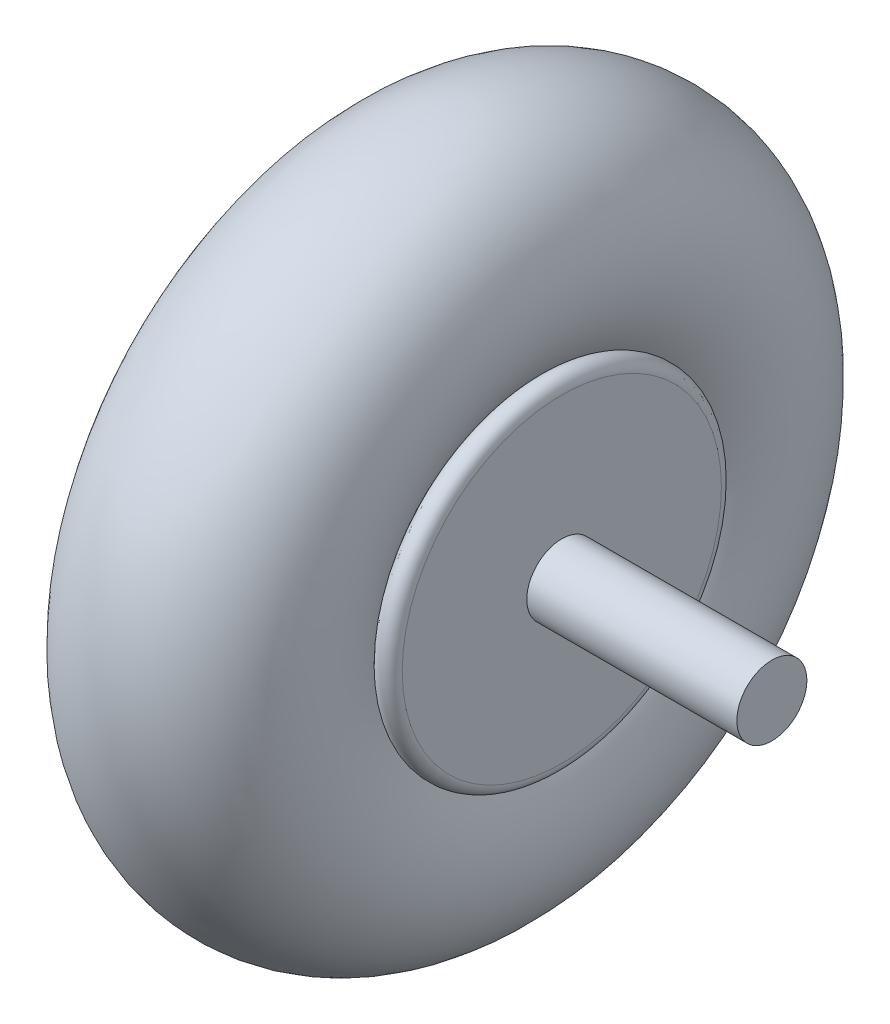
ISO-10303-21;
HEADER;
FILE_DESCRIPTION(('STEP AP214'),'2;1');
FILE_NAME('part.step','',(''),(''),'','','');
FILE_SCHEMA(('AUTOMOTIVE_DESIGN { 1 0 10303 214 1 1 1 1 }'));
ENDSEC;
DATA;
#1=APPLICATION_CONTEXT('core data for automotive mechanical design processes');
#2=APPLICATION_PROTOCOL_DEFINITION('international standard','automotive_design',2000,#1);
#3=PRODUCT_CONTEXT('',#1,'mechanical');
#4=PRODUCT('Part','Part','',(#3));
#5=PRODUCT_RELATED_PRODUCT_CATEGORY('part','',(#4));
#6=PRODUCT_DEFINITION_FORMATION('','',#4);
#7=PRODUCT_DEFINITION_CONTEXT('part definition',#1,'design');
#8=PRODUCT_DEFINITION('design','',#6,#7);
#9=PRODUCT_DEFINITION_SHAPE('','',#8);
#10=(LENGTH_UNIT() NAMED_UNIT(*) SI_UNIT(.MILLI.,.METRE.));
#11=(NAMED_UNIT(*) PLANE_ANGLE_UNIT() SI_UNIT($,.RADIAN.));
#12=(NAMED_UNIT(*) SI_UNIT($,.STERADIAN.) SOLID_ANGLE_UNIT());
#13=UNCERTAINTY_MEASURE_WITH_UNIT(LENGTH_MEASURE(1.E-05),#10,'distance_accuracy_value','');
#14=(GEOMETRIC_REPRESENTATION_CONTEXT(3) GLOBAL_UNCERTAINTY_ASSIGNED_CONTEXT((#13)) GLOBAL_UNIT_ASSIGNED_CONTEXT((#10,
#11,#12)) REPRESENTATION_CONTEXT('',''));
#15=CARTESIAN_POINT('',(0.,0.,0.));
#16=DIRECTION('',(0.,0.,1.));
#17=DIRECTION('',(1.,0.,0.));
#18=AXIS2_PLACEMENT_3D('',#15,#16,#17);
#19=CARTESIAN_POINT('',(-18.,0.,0.));
#20=DIRECTION('',(1.,0.,0.));
#21=DIRECTION('',(0.,0.,-1.));
#22=AXIS2_PLACEMENT_3D('',#19,#20,#21);
#23=CYLINDRICAL_SURFACE('',#22,3.);
#24=CARTESIAN_POINT('',(-18.,0.,0.));
#25=DIRECTION('',(-1.,0.,0.));
#26=DIRECTION('',(0.,0.,1.));
#27=AXIS2_PLACEMENT_3D('',#24,#25,#26);
#28=CIRCLE('',#27,3.);
#29=CARTESIAN_POINT('',(-18.,0.,3.));
#30=VERTEX_POINT('',#29);
#31=EDGE_CURVE('E11',#30,#30,#28,.T.);
#32=ORIENTED_EDGE('',*,*,#31,.F.);
#33=EDGE_LOOP('',(#32));
#34=FACE_BOUND('',#33,.T.);
#35=CARTESIAN_POINT('',(-10.,0.,0.));
#36=DIRECTION('',(1.,0.,0.));
#37=DIRECTION('',(0.,0.,-1.));
#38=AXIS2_PLACEMENT_3D('',#35,#36,#37);
#39=CIRCLE('',#38,3.);
#40=CARTESIAN_POINT('',(-10.,0.,-3.));
#41=VERTEX_POINT('',#40);
#42=EDGE_CURVE('E49',#41,#41,#39,.T.);
#43=ORIENTED_EDGE('',*,*,#42,.F.);
#44=EDGE_LOOP('',(#43));
#45=FACE_BOUND('',#44,.T.);
#46=ADVANCED_FACE('F43',(#34,#45),#23,.T.);
#47=CARTESIAN_POINT('',(-18.,0.,0.));
#48=DIRECTION('',(-1.,0.,0.));
#49=DIRECTION('',(0.,0.,1.));
#50=AXIS2_PLACEMENT_3D('',#47,#48,#49);
#51=PLANE('',#50);
#52=ORIENTED_EDGE('',*,*,#31,.T.);
#53=EDGE_LOOP('',(#52));
#54=FACE_BOUND('',#53,.T.);
#55=ADVANCED_FACE('F102',(#54),#51,.T.);
#56=CARTESIAN_POINT('',(-10.,20.,0.));
#57=DIRECTION('',(1.,0.,0.));
#58=DIRECTION('',(0.,0.,-1.));
#59=AXIS2_PLACEMENT_3D('',#56,#57,#58);
#60=PLANE('',#59);
#61=CARTESIAN_POINT('',(-10.,0.,0.));
#62=DIRECTION('',(1.,0.,0.));
#63=DIRECTION('',(0.,0.,-1.));
#64=AXIS2_PLACEMENT_3D('',#61,#62,#63);
#65=CIRCLE('',#64,13.6754446796632);
#66=CARTESIAN_POINT('',(-10.,0.,-13.6754446796632));
#67=VERTEX_POINT('',#66);
#68=EDGE_CURVE('E65',#67,#67,#65,.F.);
#69=ORIENTED_EDGE('',*,*,#68,.T.);
#70=EDGE_LOOP('',(#69));
#71=FACE_BOUND('',#70,.T.);
#72=ORIENTED_EDGE('',*,*,#42,.T.);
#73=EDGE_LOOP('',(#72));
#74=FACE_BOUND('',#73,.T.);
#75=ADVANCED_FACE('F93',(#71,#74),#60,.F.);
#76=CARTESIAN_POINT('',(28.,0.,0.));
#77=DIRECTION('',(-1.,0.,0.));
#78=DIRECTION('',(0.,0.,1.));
#79=AXIS2_PLACEMENT_3D('',#76,#77,#78);
#80=CYLINDRICAL_SURFACE('',#79,3.);
#81=CARTESIAN_POINT('',(28.,0.,0.));
#82=DIRECTION('',(1.,0.,0.));
#83=DIRECTION('',(0.,0.,-1.));
#84=AXIS2_PLACEMENT_3D('',#81,#82,#83);
#85=CIRCLE('',#84,3.);
#86=CARTESIAN_POINT('',(28.,0.,-3.));
#87=VERTEX_POINT('',#86);
#88=EDGE_CURVE('E53',#87,#87,#85,.T.);
#89=ORIENTED_EDGE('',*,*,#88,.F.);
#90=EDGE_LOOP('',(#89));
#91=FACE_BOUND('',#90,.T.);
#92=CARTESIAN_POINT('',(10.,0.,0.));
#93=DIRECTION('',(-1.,0.,0.));
#94=DIRECTION('',(0.,0.,1.));
#95=AXIS2_PLACEMENT_3D('',#92,#93,#94);
#96=CIRCLE('',#95,3.);
#97=CARTESIAN_POINT('',(10.,0.,3.));
#98=VERTEX_POINT('',#97);
#99=EDGE_CURVE('E57',#98,#98,#96,.T.);
#100=ORIENTED_EDGE('',*,*,#99,.F.);
#101=EDGE_LOOP('',(#100));
#102=FACE_BOUND('',#101,.T.);
#103=ADVANCED_FACE('F91',(#91,#102),#80,.T.);
#104=CARTESIAN_POINT('',(28.,0.,0.));
#105=DIRECTION('',(1.,0.,0.));
#106=DIRECTION('',(0.,0.,-1.));
#107=AXIS2_PLACEMENT_3D('',#104,#105,#106);
#108=PLANE('',#107);
#109=ORIENTED_EDGE('',*,*,#88,.T.);
#110=EDGE_LOOP('',(#109));
#111=FACE_BOUND('',#110,.T.);
#112=ADVANCED_FACE('F87',(#111),#108,.T.);
#113=CARTESIAN_POINT('',(10.,20.,0.));
#114=DIRECTION('',(-1.,0.,0.));
#115=DIRECTION('',(0.,0.,1.));
#116=AXIS2_PLACEMENT_3D('',#113,#114,#115);
#117=PLANE('',#116);
#118=CARTESIAN_POINT('',(10.,0.,0.));
#119=DIRECTION('',(-1.,0.,0.));
#120=DIRECTION('',(0.,0.,1.));
#121=AXIS2_PLACEMENT_3D('',#118,#119,#120);
#122=CIRCLE('',#121,13.6754446796632);
#123=CARTESIAN_POINT('',(10.,0.,13.6754446796632));
#124=VERTEX_POINT('',#123);
#125=EDGE_CURVE('E62',#124,#124,#122,.F.);
#126=ORIENTED_EDGE('',*,*,#125,.T.);
#127=EDGE_LOOP('',(#126));
#128=FACE_BOUND('',#127,.T.);
#129=ORIENTED_EDGE('',*,*,#99,.T.);
#130=EDGE_LOOP('',(#129));
#131=FACE_BOUND('',#130,.T.);
#132=ADVANCED_FACE('F84',(#128,#131),#117,.F.);
#133=CARTESIAN_POINT('',(0.,0.,0.));
#134=DIRECTION('',(1.,0.,0.));
#135=DIRECTION('',(0.,0.,-1.));
#136=AXIS2_PLACEMENT_3D('',#133,#134,#135);
#137=TOROIDAL_SURFACE('',#136,20.,10.);
#138=CARTESIAN_POINT('',(-8.18181818181819,0.,0.));
#139=DIRECTION('',(1.,0.,0.));
#140=DIRECTION('',(0.,0.,-1.));
#141=AXIS2_PLACEMENT_3D('',#138,#139,#140);
#142=CIRCLE('',#141,14.2504042542393);
#143=CARTESIAN_POINT('',(-8.18181818181819,0.,-14.2504042542393));
#144=VERTEX_POINT('',#143);
#145=EDGE_CURVE('E68',#144,#144,#142,.T.);
#146=ORIENTED_EDGE('',*,*,#145,.T.);
#147=EDGE_LOOP('',(#146));
#148=FACE_BOUND('',#147,.T.);
#149=CARTESIAN_POINT('',(8.18181818181819,0.,0.));
#150=DIRECTION('',(-1.,0.,0.));
#151=DIRECTION('',(0.,0.,1.));
#152=AXIS2_PLACEMENT_3D('',#149,#150,#151);
#153=CIRCLE('',#152,14.2504042542393);
#154=CARTESIAN_POINT('',(8.18181818181819,0.,14.2504042542393));
#155=VERTEX_POINT('',#154);
#156=EDGE_CURVE('E71',#155,#155,#153,.T.);
#157=ORIENTED_EDGE('',*,*,#156,.T.);
#158=EDGE_LOOP('',(#157));
#159=FACE_BOUND('',#158,.T.);
#160=ADVANCED_FACE('F75',(#148,#159),#137,.F.);
#161=CARTESIAN_POINT('',(-9.,0.,0.));
#162=DIRECTION('',(-1.,0.,0.));
#163=DIRECTION('',(0.,0.,1.));
#164=AXIS2_PLACEMENT_3D('',#161,#162,#163);
#165=TOROIDAL_SURFACE('',#164,13.6754446796632,1.);
#166=ORIENTED_EDGE('',*,*,#68,.F.);
#167=EDGE_LOOP('',(#166));
#168=FACE_BOUND('',#167,.T.);
#169=ORIENTED_EDGE('',*,*,#145,.F.);
#170=EDGE_LOOP('',(#169));
#171=FACE_BOUND('',#170,.T.);
#172=ADVANCED_FACE('F80',(#168,#171),#165,.T.);
#173=CARTESIAN_POINT('',(9.,0.,0.));
#174=DIRECTION('',(1.,0.,0.));
#175=DIRECTION('',(0.,0.,-1.));
#176=AXIS2_PLACEMENT_3D('',#173,#174,#175);
#177=TOROIDAL_SURFACE('',#176,13.6754446796632,1.);
#178=ORIENTED_EDGE('',*,*,#156,.F.);
#179=EDGE_LOOP('',(#178));
#180=FACE_BOUND('',#179,.T.);
#181=ORIENTED_EDGE('',*,*,#125,.F.);
#182=EDGE_LOOP('',(#181));
#183=FACE_BOUND('',#182,.T.);
#184=ADVANCED_FACE('F77',(#180,#183),#177,.T.);
#185=CLOSED_SHELL('',(#46,#55,#75,#103,#112,#132,#160,#172,#184));
#186=MANIFOLD_SOLID_BREP('B2',#185);
#187=CARTESIAN_POINT('',(0.,0.,0.));
#188=DIRECTION('',(-1.,0.,0.));
#189=DIRECTION('',(0.,0.,1.));
#190=AXIS2_PLACEMENT_3D('',#187,#188,#189);
#191=TOROIDAL_SURFACE('',#190,20.,10.);
#192=CARTESIAN_POINT('',(0.,0.,30.));
#193=VERTEX_POINT('',#192);
#194=VERTEX_LOOP('',#193);
#195=FACE_BOUND('',#194,.T.);
#196=ADVANCED_FACE('F186',(#195),#191,.T.);
#197=CLOSED_SHELL('',(#196));
#198=MANIFOLD_SOLID_BREP('B6',#197);
#199=ADVANCED_BREP_SHAPE_REPRESENTATION('',(#18,#186,#198),#14);
#200=SHAPE_DEFINITION_REPRESENTATION(#9,#199);
ENDSEC;
END-ISO-10303-21;
